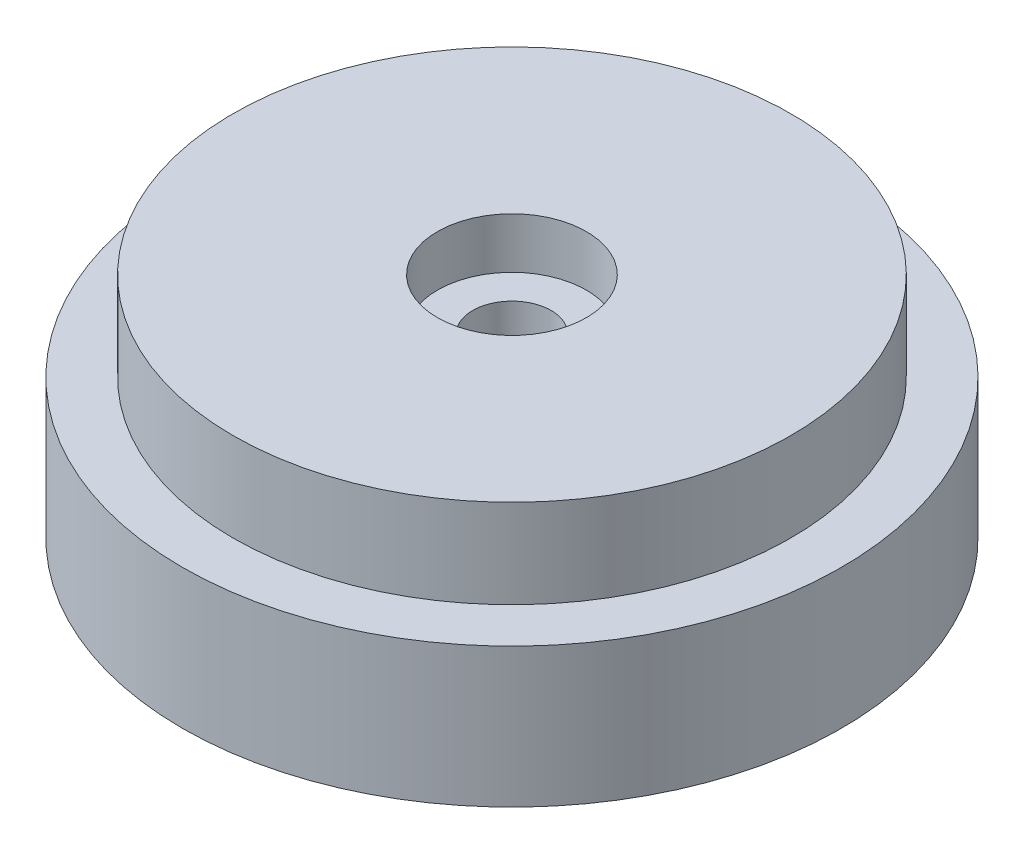
ISO-10303-21;
HEADER;
FILE_DESCRIPTION(('STEP AP214'),'2;1');
FILE_NAME('part.step','',(''),(''),'','','');
FILE_SCHEMA(('AUTOMOTIVE_DESIGN { 1 0 10303 214 1 1 1 1 }'));
ENDSEC;
DATA;
#1=APPLICATION_CONTEXT('core data for automotive mechanical design processes');
#2=APPLICATION_PROTOCOL_DEFINITION('international standard','automotive_design',2000,#1);
#3=PRODUCT_CONTEXT('',#1,'mechanical');
#4=PRODUCT('Part','Part','',(#3));
#5=PRODUCT_RELATED_PRODUCT_CATEGORY('part','',(#4));
#6=PRODUCT_DEFINITION_FORMATION('','',#4);
#7=PRODUCT_DEFINITION_CONTEXT('part definition',#1,'design');
#8=PRODUCT_DEFINITION('design','',#6,#7);
#9=PRODUCT_DEFINITION_SHAPE('','',#8);
#10=(LENGTH_UNIT() NAMED_UNIT(*) SI_UNIT(.MILLI.,.METRE.));
#11=(NAMED_UNIT(*) PLANE_ANGLE_UNIT() SI_UNIT($,.RADIAN.));
#12=(NAMED_UNIT(*) SI_UNIT($,.STERADIAN.) SOLID_ANGLE_UNIT());
#13=UNCERTAINTY_MEASURE_WITH_UNIT(LENGTH_MEASURE(1.E-05),#10,'distance_accuracy_value','');
#14=(GEOMETRIC_REPRESENTATION_CONTEXT(3) GLOBAL_UNCERTAINTY_ASSIGNED_CONTEXT((#13)) GLOBAL_UNIT_ASSIGNED_CONTEXT((#10,
#11,#12)) REPRESENTATION_CONTEXT('',''));
#15=CARTESIAN_POINT('',(0.,0.,0.));
#16=DIRECTION('',(0.,0.,1.));
#17=DIRECTION('',(1.,0.,0.));
#18=AXIS2_PLACEMENT_3D('',#15,#16,#17);
#19=CARTESIAN_POINT('',(0.,9.,0.));
#20=DIRECTION('',(0.,-1.,0.));
#21=DIRECTION('',(0.,0.,-1.));
#22=AXIS2_PLACEMENT_3D('',#19,#20,#21);
#23=CYLINDRICAL_SURFACE('',#22,2.94);
#24=CARTESIAN_POINT('',(0.,7.,0.));
#25=DIRECTION('',(0.,1.,0.));
#26=DIRECTION('',(0.,0.,1.));
#27=AXIS2_PLACEMENT_3D('',#24,#25,#26);
#28=CIRCLE('',#27,2.94);
#29=CARTESIAN_POINT('',(0.,7.,2.94));
#30=VERTEX_POINT('',#29);
#31=EDGE_CURVE('E10',#30,#30,#28,.T.);
#32=ORIENTED_EDGE('',*,*,#31,.F.);
#33=EDGE_LOOP('',(#32));
#34=FACE_BOUND('',#33,.T.);
#35=CARTESIAN_POINT('',(0.,9.,0.));
#36=DIRECTION('',(0.,1.,0.));
#37=DIRECTION('',(0.,0.,1.));
#38=AXIS2_PLACEMENT_3D('',#35,#36,#37);
#39=CIRCLE('',#38,2.94);
#40=CARTESIAN_POINT('',(0.,9.,2.94));
#41=VERTEX_POINT('',#40);
#42=EDGE_CURVE('E51',#41,#41,#39,.T.);
#43=ORIENTED_EDGE('',*,*,#42,.T.);
#44=EDGE_LOOP('',(#43));
#45=FACE_BOUND('',#44,.T.);
#46=ADVANCED_FACE('F41',(#34,#45),#23,.F.);
#47=CARTESIAN_POINT('',(0.,9.,0.));
#48=DIRECTION('',(0.,-1.,0.));
#49=DIRECTION('',(0.,0.,-1.));
#50=AXIS2_PLACEMENT_3D('',#47,#48,#49);
#51=CYLINDRICAL_SURFACE('',#50,11.);
#52=CARTESIAN_POINT('',(0.,5.5,0.));
#53=DIRECTION('',(0.,1.,0.));
#54=DIRECTION('',(0.,0.,1.));
#55=AXIS2_PLACEMENT_3D('',#52,#53,#54);
#56=CIRCLE('',#55,11.);
#57=CARTESIAN_POINT('',(0.,5.5,11.));
#58=VERTEX_POINT('',#57);
#59=EDGE_CURVE('E97',#58,#58,#56,.T.);
#60=ORIENTED_EDGE('',*,*,#59,.T.);
#61=EDGE_LOOP('',(#60));
#62=FACE_BOUND('',#61,.T.);
#63=CARTESIAN_POINT('',(0.,9.,0.));
#64=DIRECTION('',(0.,1.,0.));
#65=DIRECTION('',(0.,0.,1.));
#66=AXIS2_PLACEMENT_3D('',#63,#64,#65);
#67=CIRCLE('',#66,11.);
#68=CARTESIAN_POINT('',(0.,9.,11.));
#69=VERTEX_POINT('',#68);
#70=EDGE_CURVE('E47',#69,#69,#67,.T.);
#71=ORIENTED_EDGE('',*,*,#70,.F.);
#72=EDGE_LOOP('',(#71));
#73=FACE_BOUND('',#72,.T.);
#74=ADVANCED_FACE('F103',(#62,#73),#51,.T.);
#75=CARTESIAN_POINT('',(0.,9.,0.));
#76=DIRECTION('',(0.,1.,0.));
#77=DIRECTION('',(0.,0.,1.));
#78=AXIS2_PLACEMENT_3D('',#75,#76,#77);
#79=PLANE('',#78);
#80=ORIENTED_EDGE('',*,*,#42,.F.);
#81=EDGE_LOOP('',(#80));
#82=FACE_BOUND('',#81,.T.);
#83=ORIENTED_EDGE('',*,*,#70,.T.);
#84=EDGE_LOOP('',(#83));
#85=FACE_BOUND('',#84,.T.);
#86=ADVANCED_FACE('F122',(#82,#85),#79,.T.);
#87=CARTESIAN_POINT('',(0.,0.,0.));
#88=DIRECTION('',(0.,1.,0.));
#89=DIRECTION('',(0.,0.,1.));
#90=AXIS2_PLACEMENT_3D('',#87,#88,#89);
#91=PLANE('',#90);
#92=CARTESIAN_POINT('',(-5.,0.,-5.));
#93=DIRECTION('',(0.,1.,0.));
#94=DIRECTION('',(0.,0.,1.));
#95=AXIS2_PLACEMENT_3D('',#92,#93,#94);
#96=CIRCLE('',#95,3.05);
#97=CARTESIAN_POINT('',(-5.,0.,-8.05));
#98=VERTEX_POINT('',#97);
#99=EDGE_CURVE('E76',#98,#98,#96,.T.);
#100=ORIENTED_EDGE('',*,*,#99,.T.);
#101=EDGE_LOOP('',(#100));
#102=FACE_BOUND('',#101,.T.);
#103=CARTESIAN_POINT('',(-5.,0.,5.));
#104=DIRECTION('',(0.,1.,0.));
#105=DIRECTION('',(0.,0.,1.));
#106=AXIS2_PLACEMENT_3D('',#103,#104,#105);
#107=CIRCLE('',#106,3.05);
#108=CARTESIAN_POINT('',(-5.,0.,1.95));
#109=VERTEX_POINT('',#108);
#110=EDGE_CURVE('E83',#109,#109,#107,.T.);
#111=ORIENTED_EDGE('',*,*,#110,.T.);
#112=EDGE_LOOP('',(#111));
#113=FACE_BOUND('',#112,.T.);
#114=CARTESIAN_POINT('',(5.,0.,5.));
#115=DIRECTION('',(0.,1.,0.));
#116=DIRECTION('',(0.,0.,1.));
#117=AXIS2_PLACEMENT_3D('',#114,#115,#116);
#118=CIRCLE('',#117,3.05);
#119=CARTESIAN_POINT('',(5.,0.,1.95));
#120=VERTEX_POINT('',#119);
#121=EDGE_CURVE('E89',#120,#120,#118,.T.);
#122=ORIENTED_EDGE('',*,*,#121,.T.);
#123=EDGE_LOOP('',(#122));
#124=FACE_BOUND('',#123,.T.);
#125=CARTESIAN_POINT('',(5.,0.,-5.));
#126=DIRECTION('',(0.,1.,0.));
#127=DIRECTION('',(0.,0.,1.));
#128=AXIS2_PLACEMENT_3D('',#125,#126,#127);
#129=CIRCLE('',#128,3.05);
#130=CARTESIAN_POINT('',(5.,0.,-8.05));
#131=VERTEX_POINT('',#130);
#132=EDGE_CURVE('E70',#131,#131,#129,.T.);
#133=ORIENTED_EDGE('',*,*,#132,.T.);
#134=EDGE_LOOP('',(#133));
#135=FACE_BOUND('',#134,.T.);
#136=CARTESIAN_POINT('',(0.,0.,0.));
#137=DIRECTION('',(0.,1.,0.));
#138=DIRECTION('',(0.,0.,1.));
#139=AXIS2_PLACEMENT_3D('',#136,#137,#138);
#140=CIRCLE('',#139,2.94);
#141=CARTESIAN_POINT('',(0.,0.,2.94));
#142=VERTEX_POINT('',#141);
#143=EDGE_CURVE('E61',#142,#142,#140,.T.);
#144=ORIENTED_EDGE('',*,*,#143,.T.);
#145=EDGE_LOOP('',(#144));
#146=FACE_BOUND('',#145,.T.);
#147=CARTESIAN_POINT('',(0.,0.,0.));
#148=DIRECTION('',(0.,1.,0.));
#149=DIRECTION('',(0.,0.,1.));
#150=AXIS2_PLACEMENT_3D('',#147,#148,#149);
#151=CIRCLE('',#150,13.);
#152=CARTESIAN_POINT('',(0.,0.,13.));
#153=VERTEX_POINT('',#152);
#154=EDGE_CURVE('E94',#153,#153,#151,.T.);
#155=ORIENTED_EDGE('',*,*,#154,.F.);
#156=EDGE_LOOP('',(#155));
#157=FACE_BOUND('',#156,.T.);
#158=ADVANCED_FACE('F119',(#102,#113,#124,#135,#146,#157),#91,.F.);
#159=CARTESIAN_POINT('',(0.,7.,0.));
#160=DIRECTION('',(0.,-1.,0.));
#161=DIRECTION('',(0.,0.,-1.));
#162=AXIS2_PLACEMENT_3D('',#159,#160,#161);
#163=CYLINDRICAL_SURFACE('',#162,1.55);
#164=CARTESIAN_POINT('',(0.,3.,0.));
#165=DIRECTION('',(0.,1.,0.));
#166=DIRECTION('',(0.,0.,1.));
#167=AXIS2_PLACEMENT_3D('',#164,#165,#166);
#168=CIRCLE('',#167,1.55);
#169=CARTESIAN_POINT('',(0.,3.,1.55));
#170=VERTEX_POINT('',#169);
#171=EDGE_CURVE('E64',#170,#170,#168,.T.);
#172=ORIENTED_EDGE('',*,*,#171,.F.);
#173=EDGE_LOOP('',(#172));
#174=FACE_BOUND('',#173,.T.);
#175=CARTESIAN_POINT('',(0.,7.,0.));
#176=DIRECTION('',(0.,1.,0.));
#177=DIRECTION('',(0.,0.,1.));
#178=AXIS2_PLACEMENT_3D('',#175,#176,#177);
#179=CIRCLE('',#178,1.55);
#180=CARTESIAN_POINT('',(0.,7.,1.55));
#181=VERTEX_POINT('',#180);
#182=EDGE_CURVE('E55',#181,#181,#179,.T.);
#183=ORIENTED_EDGE('',*,*,#182,.T.);
#184=EDGE_LOOP('',(#183));
#185=FACE_BOUND('',#184,.T.);
#186=ADVANCED_FACE('F121',(#174,#185),#163,.F.);
#187=CARTESIAN_POINT('',(0.,7.,0.));
#188=DIRECTION('',(0.,1.,0.));
#189=DIRECTION('',(0.,0.,1.));
#190=AXIS2_PLACEMENT_3D('',#187,#188,#189);
#191=PLANE('',#190);
#192=ORIENTED_EDGE('',*,*,#182,.F.);
#193=EDGE_LOOP('',(#192));
#194=FACE_BOUND('',#193,.T.);
#195=ORIENTED_EDGE('',*,*,#31,.T.);
#196=EDGE_LOOP('',(#195));
#197=FACE_BOUND('',#196,.T.);
#198=ADVANCED_FACE('F129',(#194,#197),#191,.T.);
#199=CARTESIAN_POINT('',(0.,3.,0.));
#200=DIRECTION('',(0.,-1.,0.));
#201=DIRECTION('',(0.,0.,-1.));
#202=AXIS2_PLACEMENT_3D('',#199,#200,#201);
#203=CYLINDRICAL_SURFACE('',#202,2.94);
#204=CARTESIAN_POINT('',(0.,3.,0.));
#205=DIRECTION('',(0.,1.,0.));
#206=DIRECTION('',(0.,0.,1.));
#207=AXIS2_PLACEMENT_3D('',#204,#205,#206);
#208=CIRCLE('',#207,2.94);
#209=CARTESIAN_POINT('',(0.,3.,2.94));
#210=VERTEX_POINT('',#209);
#211=EDGE_CURVE('E60',#210,#210,#208,.T.);
#212=ORIENTED_EDGE('',*,*,#211,.T.);
#213=EDGE_LOOP('',(#212));
#214=FACE_BOUND('',#213,.T.);
#215=ORIENTED_EDGE('',*,*,#143,.F.);
#216=EDGE_LOOP('',(#215));
#217=FACE_BOUND('',#216,.T.);
#218=ADVANCED_FACE('F225',(#214,#217),#203,.F.);
#219=CARTESIAN_POINT('',(0.,3.,0.));
#220=DIRECTION('',(0.,1.,0.));
#221=DIRECTION('',(0.,0.,1.));
#222=AXIS2_PLACEMENT_3D('',#219,#220,#221);
#223=PLANE('',#222);
#224=ORIENTED_EDGE('',*,*,#171,.T.);
#225=EDGE_LOOP('',(#224));
#226=FACE_BOUND('',#225,.T.);
#227=ORIENTED_EDGE('',*,*,#211,.F.);
#228=EDGE_LOOP('',(#227));
#229=FACE_BOUND('',#228,.T.);
#230=ADVANCED_FACE('F216',(#226,#229),#223,.F.);
#231=CARTESIAN_POINT('',(5.,8.6,-5.));
#232=DIRECTION('',(0.,-1.,0.));
#233=DIRECTION('',(0.,0.,-1.));
#234=AXIS2_PLACEMENT_3D('',#231,#232,#233);
#235=CYLINDRICAL_SURFACE('',#234,3.05);
#236=CARTESIAN_POINT('',(5.,8.6,-5.));
#237=DIRECTION('',(0.,1.,0.));
#238=DIRECTION('',(0.,0.,1.));
#239=AXIS2_PLACEMENT_3D('',#236,#237,#238);
#240=CIRCLE('',#239,3.05);
#241=CARTESIAN_POINT('',(5.,8.6,-8.05));
#242=VERTEX_POINT('',#241);
#243=EDGE_CURVE('E65',#242,#242,#240,.T.);
#244=CARTESIAN_POINT('',(5.,8.6,-8.05));
#245=CARTESIAN_POINT('',(5.,8.51041666666666,-8.05));
#246=CARTESIAN_POINT('',(5.,8.42083333333333,-8.05));
#247=CARTESIAN_POINT('',(5.,8.24166666666667,-8.05));
#248=CARTESIAN_POINT('',(5.,8.15208333333333,-8.05));
#249=CARTESIAN_POINT('',(5.,7.97291666666667,-8.05));
#250=CARTESIAN_POINT('',(5.,7.88333333333333,-8.05));
#251=CARTESIAN_POINT('',(5.,7.70416666666667,-8.05));
#252=CARTESIAN_POINT('',(5.,7.61458333333333,-8.05));
#253=CARTESIAN_POINT('',(5.,7.43541666666667,-8.05));
#254=CARTESIAN_POINT('',(5.,7.34583333333333,-8.05));
#255=CARTESIAN_POINT('',(5.,7.16666666666667,-8.05));
#256=CARTESIAN_POINT('',(5.,7.07708333333333,-8.05));
#257=CARTESIAN_POINT('',(5.,6.89791666666667,-8.05));
#258=CARTESIAN_POINT('',(5.,6.80833333333333,-8.05));
#259=CARTESIAN_POINT('',(5.,6.62916666666667,-8.05));
#260=CARTESIAN_POINT('',(5.,6.53958333333333,-8.05));
#261=CARTESIAN_POINT('',(5.,6.36041666666667,-8.05));
#262=CARTESIAN_POINT('',(5.,6.27083333333333,-8.05));
#263=CARTESIAN_POINT('',(5.,6.09166666666667,-8.05));
#264=CARTESIAN_POINT('',(5.,6.00208333333333,-8.05));
#265=CARTESIAN_POINT('',(5.,5.82291666666667,-8.05));
#266=CARTESIAN_POINT('',(5.,5.73333333333333,-8.05));
#267=CARTESIAN_POINT('',(5.,5.55416666666667,-8.05));
#268=CARTESIAN_POINT('',(5.,5.46458333333333,-8.05));
#269=CARTESIAN_POINT('',(5.,5.28541666666667,-8.05));
#270=CARTESIAN_POINT('',(5.,5.19583333333333,-8.05));
#271=CARTESIAN_POINT('',(5.,5.01666666666667,-8.05));
#272=CARTESIAN_POINT('',(5.,4.92708333333333,-8.05));
#273=CARTESIAN_POINT('',(5.,4.74791666666667,-8.05));
#274=CARTESIAN_POINT('',(5.,4.65833333333333,-8.05));
#275=CARTESIAN_POINT('',(5.,4.47916666666667,-8.05));
#276=CARTESIAN_POINT('',(5.,4.38958333333333,-8.05));
#277=CARTESIAN_POINT('',(5.,4.21041666666667,-8.05));
#278=CARTESIAN_POINT('',(5.,4.12083333333333,-8.05));
#279=CARTESIAN_POINT('',(5.,3.94166666666667,-8.05));
#280=CARTESIAN_POINT('',(5.,3.85208333333333,-8.05));
#281=CARTESIAN_POINT('',(5.,3.67291666666667,-8.05));
#282=CARTESIAN_POINT('',(5.,3.58333333333333,-8.05));
#283=CARTESIAN_POINT('',(5.,3.40416666666667,-8.05));
#284=CARTESIAN_POINT('',(5.,3.31458333333333,-8.05));
#285=CARTESIAN_POINT('',(5.,3.13541666666667,-8.05));
#286=CARTESIAN_POINT('',(5.,3.04583333333333,-8.05));
#287=CARTESIAN_POINT('',(5.,2.86666666666667,-8.05));
#288=CARTESIAN_POINT('',(5.,2.77708333333333,-8.05));
#289=CARTESIAN_POINT('',(5.,2.59791666666667,-8.05));
#290=CARTESIAN_POINT('',(5.,2.50833333333333,-8.05));
#291=CARTESIAN_POINT('',(5.,2.32916666666667,-8.05));
#292=CARTESIAN_POINT('',(5.,2.23958333333333,-8.05));
#293=CARTESIAN_POINT('',(5.,2.06041666666667,-8.05));
#294=CARTESIAN_POINT('',(5.,1.97083333333333,-8.05));
#295=CARTESIAN_POINT('',(5.,1.79166666666667,-8.05));
#296=CARTESIAN_POINT('',(5.,1.70208333333333,-8.05));
#297=CARTESIAN_POINT('',(5.,1.52291666666667,-8.05));
#298=CARTESIAN_POINT('',(5.,1.43333333333333,-8.05));
#299=CARTESIAN_POINT('',(5.,1.25416666666667,-8.05));
#300=CARTESIAN_POINT('',(5.,1.16458333333333,-8.05));
#301=CARTESIAN_POINT('',(5.,0.985416666666665,-8.05));
#302=CARTESIAN_POINT('',(5.,0.895833333333332,-8.05));
#303=CARTESIAN_POINT('',(5.,0.716666666666665,-8.05));
#304=CARTESIAN_POINT('',(5.,0.627083333333332,-8.05));
#305=CARTESIAN_POINT('',(5.,0.447916666666665,-8.05));
#306=CARTESIAN_POINT('',(5.,0.358333333333331,-8.05));
#307=CARTESIAN_POINT('',(5.,0.179166666666665,-8.05));
#308=CARTESIAN_POINT('',(5.,0.0895833333333315,-8.05));
#309=CARTESIAN_POINT('',(5.,0.,-8.05));
#310=B_SPLINE_CURVE_WITH_KNOTS('',3,(#244,#245,#246,#247,#248,#249,#250,#251,#252,#253,#254,
#255,#256,#257,#258,#259,#260,#261,#262,#263,#264,#265,#266,#267,#268,#269,#270,#271,#272,#273,
#274,#275,#276,#277,#278,#279,#280,#281,#282,#283,#284,#285,#286,#287,#288,#289,#290,#291,#292,
#293,#294,#295,#296,#297,#298,#299,#300,#301,#302,#303,#304,#305,#306,#307,#308,#309),
.UNSPECIFIED.,.F.,.F.,(4,2,2,2,2,2,2,2,2,2,2,2,2,2,2,2,2,2,2,2,2,2,2,2,2,2,2,2,2,2,2,2,4),(0.,
0.26875,0.5375,0.806249999999999,1.075,1.34375,1.6125,1.88125,2.15,2.41875,2.6875,2.95625,3.225,
3.49375,3.7625,4.03125,4.3,4.56875,4.8375,5.10625,5.375,5.64375,5.9125,6.18125,6.45,6.71875,
6.9875,7.25625,7.525,7.79375,8.0625,8.33125,8.6),.UNSPECIFIED.);
#311=EDGE_CURVE('BSEAM207',#242,#131,#310,.T.);
#312=ORIENTED_EDGE('',*,*,#243,.T.);
#313=ORIENTED_EDGE('',*,*,#132,.F.);
#314=ORIENTED_EDGE('',*,*,#311,.T.);
#315=ORIENTED_EDGE('',*,*,#311,.F.);
#316=EDGE_LOOP('',(#312,#314,#313,#315));
#317=FACE_BOUND('',#316,.T.);
#318=ADVANCED_FACE('F207',(#317),#235,.F.);
#319=CARTESIAN_POINT('',(0.,8.6,0.));
#320=DIRECTION('',(0.,1.,0.));
#321=DIRECTION('',(0.,0.,1.));
#322=AXIS2_PLACEMENT_3D('',#319,#320,#321);
#323=PLANE('',#322);
#324=ORIENTED_EDGE('',*,*,#243,.F.);
#325=EDGE_LOOP('',(#324));
#326=FACE_BOUND('',#325,.T.);
#327=ADVANCED_FACE('F198',(#326),#323,.F.);
#328=CARTESIAN_POINT('',(5.,8.6,5.));
#329=DIRECTION('',(0.,-1.,0.));
#330=DIRECTION('',(0.,0.,-1.));
#331=AXIS2_PLACEMENT_3D('',#328,#329,#330);
#332=CYLINDRICAL_SURFACE('',#331,3.05);
#333=CARTESIAN_POINT('',(5.,8.6,5.));
#334=DIRECTION('',(0.,1.,0.));
#335=DIRECTION('',(0.,0.,1.));
#336=AXIS2_PLACEMENT_3D('',#333,#334,#335);
#337=CIRCLE('',#336,3.05);
#338=CARTESIAN_POINT('',(5.,8.6,1.95));
#339=VERTEX_POINT('',#338);
#340=EDGE_CURVE('E73',#339,#339,#337,.T.);
#341=CARTESIAN_POINT('',(5.,8.6,1.95));
#342=CARTESIAN_POINT('',(5.,8.51041666666666,1.95));
#343=CARTESIAN_POINT('',(5.,8.42083333333333,1.95));
#344=CARTESIAN_POINT('',(5.,8.24166666666667,1.95));
#345=CARTESIAN_POINT('',(5.,8.15208333333333,1.95));
#346=CARTESIAN_POINT('',(5.,7.97291666666667,1.95));
#347=CARTESIAN_POINT('',(5.,7.88333333333333,1.95));
#348=CARTESIAN_POINT('',(5.,7.70416666666667,1.95));
#349=CARTESIAN_POINT('',(5.,7.61458333333333,1.95));
#350=CARTESIAN_POINT('',(5.,7.43541666666667,1.95));
#351=CARTESIAN_POINT('',(5.,7.34583333333333,1.95));
#352=CARTESIAN_POINT('',(5.,7.16666666666667,1.95));
#353=CARTESIAN_POINT('',(5.,7.07708333333333,1.95));
#354=CARTESIAN_POINT('',(5.,6.89791666666667,1.95));
#355=CARTESIAN_POINT('',(5.,6.80833333333333,1.95));
#356=CARTESIAN_POINT('',(5.,6.62916666666667,1.95));
#357=CARTESIAN_POINT('',(5.,6.53958333333333,1.95));
#358=CARTESIAN_POINT('',(5.,6.36041666666667,1.95));
#359=CARTESIAN_POINT('',(5.,6.27083333333333,1.95));
#360=CARTESIAN_POINT('',(5.,6.09166666666667,1.95));
#361=CARTESIAN_POINT('',(5.,6.00208333333333,1.95));
#362=CARTESIAN_POINT('',(5.,5.82291666666667,1.95));
#363=CARTESIAN_POINT('',(5.,5.73333333333333,1.95));
#364=CARTESIAN_POINT('',(5.,5.55416666666667,1.95));
#365=CARTESIAN_POINT('',(5.,5.46458333333333,1.95));
#366=CARTESIAN_POINT('',(5.,5.28541666666667,1.95));
#367=CARTESIAN_POINT('',(5.,5.19583333333333,1.95));
#368=CARTESIAN_POINT('',(5.,5.01666666666667,1.95));
#369=CARTESIAN_POINT('',(5.,4.92708333333333,1.95));
#370=CARTESIAN_POINT('',(5.,4.74791666666667,1.95));
#371=CARTESIAN_POINT('',(5.,4.65833333333333,1.95));
#372=CARTESIAN_POINT('',(5.,4.47916666666667,1.95));
#373=CARTESIAN_POINT('',(5.,4.38958333333333,1.95));
#374=CARTESIAN_POINT('',(5.,4.21041666666667,1.95));
#375=CARTESIAN_POINT('',(5.,4.12083333333333,1.95));
#376=CARTESIAN_POINT('',(5.,3.94166666666667,1.95));
#377=CARTESIAN_POINT('',(5.,3.85208333333333,1.95));
#378=CARTESIAN_POINT('',(5.,3.67291666666667,1.95));
#379=CARTESIAN_POINT('',(5.,3.58333333333333,1.95));
#380=CARTESIAN_POINT('',(5.,3.40416666666667,1.95));
#381=CARTESIAN_POINT('',(5.,3.31458333333333,1.95));
#382=CARTESIAN_POINT('',(5.,3.13541666666667,1.95));
#383=CARTESIAN_POINT('',(5.,3.04583333333333,1.95));
#384=CARTESIAN_POINT('',(5.,2.86666666666667,1.95));
#385=CARTESIAN_POINT('',(5.,2.77708333333333,1.95));
#386=CARTESIAN_POINT('',(5.,2.59791666666667,1.95));
#387=CARTESIAN_POINT('',(5.,2.50833333333333,1.95));
#388=CARTESIAN_POINT('',(5.,2.32916666666667,1.95));
#389=CARTESIAN_POINT('',(5.,2.23958333333333,1.95));
#390=CARTESIAN_POINT('',(5.,2.06041666666667,1.95));
#391=CARTESIAN_POINT('',(5.,1.97083333333333,1.95));
#392=CARTESIAN_POINT('',(5.,1.79166666666667,1.95));
#393=CARTESIAN_POINT('',(5.,1.70208333333333,1.95));
#394=CARTESIAN_POINT('',(5.,1.52291666666667,1.95));
#395=CARTESIAN_POINT('',(5.,1.43333333333333,1.95));
#396=CARTESIAN_POINT('',(5.,1.25416666666667,1.95));
#397=CARTESIAN_POINT('',(5.,1.16458333333333,1.95));
#398=CARTESIAN_POINT('',(5.,0.985416666666665,1.95));
#399=CARTESIAN_POINT('',(5.,0.895833333333332,1.95));
#400=CARTESIAN_POINT('',(5.,0.716666666666665,1.95));
#401=CARTESIAN_POINT('',(5.,0.627083333333332,1.95));
#402=CARTESIAN_POINT('',(5.,0.447916666666665,1.95));
#403=CARTESIAN_POINT('',(5.,0.358333333333331,1.95));
#404=CARTESIAN_POINT('',(5.,0.179166666666665,1.95));
#405=CARTESIAN_POINT('',(5.,0.0895833333333315,1.95));
#406=CARTESIAN_POINT('',(5.,0.,1.95));
#407=B_SPLINE_CURVE_WITH_KNOTS('',3,(#341,#342,#343,#344,#345,#346,#347,#348,#349,#350,#351,
#352,#353,#354,#355,#356,#357,#358,#359,#360,#361,#362,#363,#364,#365,#366,#367,#368,#369,#370,
#371,#372,#373,#374,#375,#376,#377,#378,#379,#380,#381,#382,#383,#384,#385,#386,#387,#388,#389,
#390,#391,#392,#393,#394,#395,#396,#397,#398,#399,#400,#401,#402,#403,#404,#405,#406),
.UNSPECIFIED.,.F.,.F.,(4,2,2,2,2,2,2,2,2,2,2,2,2,2,2,2,2,2,2,2,2,2,2,2,2,2,2,2,2,2,2,2,4),(0.,
0.26875,0.5375,0.806249999999999,1.075,1.34375,1.6125,1.88125,2.15,2.41875,2.6875,2.95625,3.225,
3.49375,3.7625,4.03125,4.3,4.56875,4.8375,5.10625,5.375,5.64375,5.9125,6.18125,6.45,6.71875,
6.9875,7.25625,7.525,7.79375,8.0625,8.33125,8.6),.UNSPECIFIED.);
#408=EDGE_CURVE('BSEAM189',#339,#120,#407,.T.);
#409=ORIENTED_EDGE('',*,*,#340,.T.);
#410=ORIENTED_EDGE('',*,*,#121,.F.);
#411=ORIENTED_EDGE('',*,*,#408,.T.);
#412=ORIENTED_EDGE('',*,*,#408,.F.);
#413=EDGE_LOOP('',(#409,#411,#410,#412));
#414=FACE_BOUND('',#413,.T.);
#415=ADVANCED_FACE('F189',(#414),#332,.F.);
#416=CARTESIAN_POINT('',(0.,8.6,0.));
#417=DIRECTION('',(0.,1.,0.));
#418=DIRECTION('',(0.,0.,1.));
#419=AXIS2_PLACEMENT_3D('',#416,#417,#418);
#420=PLANE('',#419);
#421=ORIENTED_EDGE('',*,*,#340,.F.);
#422=EDGE_LOOP('',(#421));
#423=FACE_BOUND('',#422,.T.);
#424=ADVANCED_FACE('F180',(#423),#420,.F.);
#425=CARTESIAN_POINT('',(-5.,8.6,5.));
#426=DIRECTION('',(0.,-1.,0.));
#427=DIRECTION('',(0.,0.,-1.));
#428=AXIS2_PLACEMENT_3D('',#425,#426,#427);
#429=CYLINDRICAL_SURFACE('',#428,3.05);
#430=CARTESIAN_POINT('',(-5.,8.6,5.));
#431=DIRECTION('',(0.,1.,0.));
#432=DIRECTION('',(0.,0.,1.));
#433=AXIS2_PLACEMENT_3D('',#430,#431,#432);
#434=CIRCLE('',#433,3.05);
#435=CARTESIAN_POINT('',(-5.,8.6,1.95));
#436=VERTEX_POINT('',#435);
#437=EDGE_CURVE('E86',#436,#436,#434,.T.);
#438=CARTESIAN_POINT('',(-5.,8.6,1.95));
#439=CARTESIAN_POINT('',(-5.,8.51041666666666,1.95));
#440=CARTESIAN_POINT('',(-5.,8.42083333333333,1.95));
#441=CARTESIAN_POINT('',(-5.,8.24166666666667,1.95));
#442=CARTESIAN_POINT('',(-5.,8.15208333333333,1.95));
#443=CARTESIAN_POINT('',(-5.,7.97291666666667,1.95));
#444=CARTESIAN_POINT('',(-5.,7.88333333333333,1.95));
#445=CARTESIAN_POINT('',(-5.,7.70416666666667,1.95));
#446=CARTESIAN_POINT('',(-5.,7.61458333333333,1.95));
#447=CARTESIAN_POINT('',(-5.,7.43541666666667,1.95));
#448=CARTESIAN_POINT('',(-5.,7.34583333333333,1.95));
#449=CARTESIAN_POINT('',(-5.,7.16666666666667,1.95));
#450=CARTESIAN_POINT('',(-5.,7.07708333333333,1.95));
#451=CARTESIAN_POINT('',(-5.,6.89791666666667,1.95));
#452=CARTESIAN_POINT('',(-5.,6.80833333333333,1.95));
#453=CARTESIAN_POINT('',(-5.,6.62916666666667,1.95));
#454=CARTESIAN_POINT('',(-5.,6.53958333333333,1.95));
#455=CARTESIAN_POINT('',(-5.,6.36041666666667,1.95));
#456=CARTESIAN_POINT('',(-5.,6.27083333333333,1.95));
#457=CARTESIAN_POINT('',(-5.,6.09166666666667,1.95));
#458=CARTESIAN_POINT('',(-5.,6.00208333333333,1.95));
#459=CARTESIAN_POINT('',(-5.,5.82291666666667,1.95));
#460=CARTESIAN_POINT('',(-5.,5.73333333333333,1.95));
#461=CARTESIAN_POINT('',(-5.,5.55416666666667,1.95));
#462=CARTESIAN_POINT('',(-5.,5.46458333333333,1.95));
#463=CARTESIAN_POINT('',(-5.,5.28541666666667,1.95));
#464=CARTESIAN_POINT('',(-5.,5.19583333333333,1.95));
#465=CARTESIAN_POINT('',(-5.,5.01666666666667,1.95));
#466=CARTESIAN_POINT('',(-5.,4.92708333333333,1.95));
#467=CARTESIAN_POINT('',(-5.,4.74791666666667,1.95));
#468=CARTESIAN_POINT('',(-5.,4.65833333333333,1.95));
#469=CARTESIAN_POINT('',(-5.,4.47916666666667,1.95));
#470=CARTESIAN_POINT('',(-5.,4.38958333333333,1.95));
#471=CARTESIAN_POINT('',(-5.,4.21041666666667,1.95));
#472=CARTESIAN_POINT('',(-5.,4.12083333333333,1.95));
#473=CARTESIAN_POINT('',(-5.,3.94166666666667,1.95));
#474=CARTESIAN_POINT('',(-5.,3.85208333333333,1.95));
#475=CARTESIAN_POINT('',(-5.,3.67291666666667,1.95));
#476=CARTESIAN_POINT('',(-5.,3.58333333333333,1.95));
#477=CARTESIAN_POINT('',(-5.,3.40416666666667,1.95));
#478=CARTESIAN_POINT('',(-5.,3.31458333333333,1.95));
#479=CARTESIAN_POINT('',(-5.,3.13541666666667,1.95));
#480=CARTESIAN_POINT('',(-5.,3.04583333333333,1.95));
#481=CARTESIAN_POINT('',(-5.,2.86666666666667,1.95));
#482=CARTESIAN_POINT('',(-5.,2.77708333333333,1.95));
#483=CARTESIAN_POINT('',(-5.,2.59791666666667,1.95));
#484=CARTESIAN_POINT('',(-5.,2.50833333333333,1.95));
#485=CARTESIAN_POINT('',(-5.,2.32916666666667,1.95));
#486=CARTESIAN_POINT('',(-5.,2.23958333333333,1.95));
#487=CARTESIAN_POINT('',(-5.,2.06041666666667,1.95));
#488=CARTESIAN_POINT('',(-5.,1.97083333333333,1.95));
#489=CARTESIAN_POINT('',(-5.,1.79166666666667,1.95));
#490=CARTESIAN_POINT('',(-5.,1.70208333333333,1.95));
#491=CARTESIAN_POINT('',(-5.,1.52291666666667,1.95));
#492=CARTESIAN_POINT('',(-5.,1.43333333333333,1.95));
#493=CARTESIAN_POINT('',(-5.,1.25416666666667,1.95));
#494=CARTESIAN_POINT('',(-5.,1.16458333333333,1.95));
#495=CARTESIAN_POINT('',(-5.,0.985416666666665,1.95));
#496=CARTESIAN_POINT('',(-5.,0.895833333333332,1.95));
#497=CARTESIAN_POINT('',(-5.,0.716666666666665,1.95));
#498=CARTESIAN_POINT('',(-5.,0.627083333333332,1.95));
#499=CARTESIAN_POINT('',(-5.,0.447916666666665,1.95));
#500=CARTESIAN_POINT('',(-5.,0.358333333333331,1.95));
#501=CARTESIAN_POINT('',(-5.,0.179166666666665,1.95));
#502=CARTESIAN_POINT('',(-5.,0.0895833333333315,1.95));
#503=CARTESIAN_POINT('',(-5.,0.,1.95));
#504=B_SPLINE_CURVE_WITH_KNOTS('',3,(#438,#439,#440,#441,#442,#443,#444,#445,#446,#447,#448,
#449,#450,#451,#452,#453,#454,#455,#456,#457,#458,#459,#460,#461,#462,#463,#464,#465,#466,#467,
#468,#469,#470,#471,#472,#473,#474,#475,#476,#477,#478,#479,#480,#481,#482,#483,#484,#485,#486,
#487,#488,#489,#490,#491,#492,#493,#494,#495,#496,#497,#498,#499,#500,#501,#502,#503),
.UNSPECIFIED.,.F.,.F.,(4,2,2,2,2,2,2,2,2,2,2,2,2,2,2,2,2,2,2,2,2,2,2,2,2,2,2,2,2,2,2,2,4),(0.,
0.26875,0.5375,0.806249999999999,1.075,1.34375,1.6125,1.88125,2.15,2.41875,2.6875,2.95625,3.225,
3.49375,3.7625,4.03125,4.3,4.56875,4.8375,5.10625,5.375,5.64375,5.9125,6.18125,6.45,6.71875,
6.9875,7.25625,7.525,7.79375,8.0625,8.33125,8.6),.UNSPECIFIED.);
#505=EDGE_CURVE('BSEAM171',#436,#109,#504,.T.);
#506=ORIENTED_EDGE('',*,*,#437,.T.);
#507=ORIENTED_EDGE('',*,*,#110,.F.);
#508=ORIENTED_EDGE('',*,*,#505,.T.);
#509=ORIENTED_EDGE('',*,*,#505,.F.);
#510=EDGE_LOOP('',(#506,#508,#507,#509));
#511=FACE_BOUND('',#510,.T.);
#512=ADVANCED_FACE('F171',(#511),#429,.F.);
#513=CARTESIAN_POINT('',(0.,8.6,0.));
#514=DIRECTION('',(0.,1.,0.));
#515=DIRECTION('',(0.,0.,1.));
#516=AXIS2_PLACEMENT_3D('',#513,#514,#515);
#517=PLANE('',#516);
#518=ORIENTED_EDGE('',*,*,#437,.F.);
#519=EDGE_LOOP('',(#518));
#520=FACE_BOUND('',#519,.T.);
#521=ADVANCED_FACE('F162',(#520),#517,.F.);
#522=CARTESIAN_POINT('',(-5.,8.6,-5.));
#523=DIRECTION('',(0.,-1.,0.));
#524=DIRECTION('',(0.,0.,-1.));
#525=AXIS2_PLACEMENT_3D('',#522,#523,#524);
#526=CYLINDRICAL_SURFACE('',#525,3.05);
#527=CARTESIAN_POINT('',(-5.,8.6,-5.));
#528=DIRECTION('',(0.,1.,0.));
#529=DIRECTION('',(0.,0.,1.));
#530=AXIS2_PLACEMENT_3D('',#527,#528,#529);
#531=CIRCLE('',#530,3.05);
#532=CARTESIAN_POINT('',(-5.,8.6,-8.05));
#533=VERTEX_POINT('',#532);
#534=EDGE_CURVE('E79',#533,#533,#531,.T.);
#535=CARTESIAN_POINT('',(-5.,8.6,-8.05));
#536=CARTESIAN_POINT('',(-5.,8.51041666666666,-8.05));
#537=CARTESIAN_POINT('',(-5.,8.42083333333333,-8.05));
#538=CARTESIAN_POINT('',(-5.,8.24166666666667,-8.05));
#539=CARTESIAN_POINT('',(-5.,8.15208333333333,-8.05));
#540=CARTESIAN_POINT('',(-5.,7.97291666666667,-8.05));
#541=CARTESIAN_POINT('',(-5.,7.88333333333333,-8.05));
#542=CARTESIAN_POINT('',(-5.,7.70416666666667,-8.05));
#543=CARTESIAN_POINT('',(-5.,7.61458333333333,-8.05));
#544=CARTESIAN_POINT('',(-5.,7.43541666666667,-8.05));
#545=CARTESIAN_POINT('',(-5.,7.34583333333333,-8.05));
#546=CARTESIAN_POINT('',(-5.,7.16666666666667,-8.05));
#547=CARTESIAN_POINT('',(-5.,7.07708333333333,-8.05));
#548=CARTESIAN_POINT('',(-5.,6.89791666666667,-8.05));
#549=CARTESIAN_POINT('',(-5.,6.80833333333333,-8.05));
#550=CARTESIAN_POINT('',(-5.,6.62916666666667,-8.05));
#551=CARTESIAN_POINT('',(-5.,6.53958333333333,-8.05));
#552=CARTESIAN_POINT('',(-5.,6.36041666666667,-8.05));
#553=CARTESIAN_POINT('',(-5.,6.27083333333333,-8.05));
#554=CARTESIAN_POINT('',(-5.,6.09166666666667,-8.05));
#555=CARTESIAN_POINT('',(-5.,6.00208333333333,-8.05));
#556=CARTESIAN_POINT('',(-5.,5.82291666666667,-8.05));
#557=CARTESIAN_POINT('',(-5.,5.73333333333333,-8.05));
#558=CARTESIAN_POINT('',(-5.,5.55416666666667,-8.05));
#559=CARTESIAN_POINT('',(-5.,5.46458333333333,-8.05));
#560=CARTESIAN_POINT('',(-5.,5.28541666666667,-8.05));
#561=CARTESIAN_POINT('',(-5.,5.19583333333333,-8.05));
#562=CARTESIAN_POINT('',(-5.,5.01666666666667,-8.05));
#563=CARTESIAN_POINT('',(-5.,4.92708333333333,-8.05));
#564=CARTESIAN_POINT('',(-5.,4.74791666666667,-8.05));
#565=CARTESIAN_POINT('',(-5.,4.65833333333333,-8.05));
#566=CARTESIAN_POINT('',(-5.,4.47916666666667,-8.05));
#567=CARTESIAN_POINT('',(-5.,4.38958333333333,-8.05));
#568=CARTESIAN_POINT('',(-5.,4.21041666666667,-8.05));
#569=CARTESIAN_POINT('',(-5.,4.12083333333333,-8.05));
#570=CARTESIAN_POINT('',(-5.,3.94166666666667,-8.05));
#571=CARTESIAN_POINT('',(-5.,3.85208333333333,-8.05));
#572=CARTESIAN_POINT('',(-5.,3.67291666666667,-8.05));
#573=CARTESIAN_POINT('',(-5.,3.58333333333333,-8.05));
#574=CARTESIAN_POINT('',(-5.,3.40416666666667,-8.05));
#575=CARTESIAN_POINT('',(-5.,3.31458333333333,-8.05));
#576=CARTESIAN_POINT('',(-5.,3.13541666666667,-8.05));
#577=CARTESIAN_POINT('',(-5.,3.04583333333333,-8.05));
#578=CARTESIAN_POINT('',(-5.,2.86666666666667,-8.05));
#579=CARTESIAN_POINT('',(-5.,2.77708333333333,-8.05));
#580=CARTESIAN_POINT('',(-5.,2.59791666666667,-8.05));
#581=CARTESIAN_POINT('',(-5.,2.50833333333333,-8.05));
#582=CARTESIAN_POINT('',(-5.,2.32916666666667,-8.05));
#583=CARTESIAN_POINT('',(-5.,2.23958333333333,-8.05));
#584=CARTESIAN_POINT('',(-5.,2.06041666666667,-8.05));
#585=CARTESIAN_POINT('',(-5.,1.97083333333333,-8.05));
#586=CARTESIAN_POINT('',(-5.,1.79166666666667,-8.05));
#587=CARTESIAN_POINT('',(-5.,1.70208333333333,-8.05));
#588=CARTESIAN_POINT('',(-5.,1.52291666666667,-8.05));
#589=CARTESIAN_POINT('',(-5.,1.43333333333333,-8.05));
#590=CARTESIAN_POINT('',(-5.,1.25416666666667,-8.05));
#591=CARTESIAN_POINT('',(-5.,1.16458333333333,-8.05));
#592=CARTESIAN_POINT('',(-5.,0.985416666666665,-8.05));
#593=CARTESIAN_POINT('',(-5.,0.895833333333332,-8.05));
#594=CARTESIAN_POINT('',(-5.,0.716666666666665,-8.05));
#595=CARTESIAN_POINT('',(-5.,0.627083333333332,-8.05));
#596=CARTESIAN_POINT('',(-5.,0.447916666666665,-8.05));
#597=CARTESIAN_POINT('',(-5.,0.358333333333331,-8.05));
#598=CARTESIAN_POINT('',(-5.,0.179166666666665,-8.05));
#599=CARTESIAN_POINT('',(-5.,0.0895833333333315,-8.05));
#600=CARTESIAN_POINT('',(-5.,0.,-8.05));
#601=B_SPLINE_CURVE_WITH_KNOTS('',3,(#535,#536,#537,#538,#539,#540,#541,#542,#543,#544,#545,
#546,#547,#548,#549,#550,#551,#552,#553,#554,#555,#556,#557,#558,#559,#560,#561,#562,#563,#564,
#565,#566,#567,#568,#569,#570,#571,#572,#573,#574,#575,#576,#577,#578,#579,#580,#581,#582,#583,
#584,#585,#586,#587,#588,#589,#590,#591,#592,#593,#594,#595,#596,#597,#598,#599,#600),
.UNSPECIFIED.,.F.,.F.,(4,2,2,2,2,2,2,2,2,2,2,2,2,2,2,2,2,2,2,2,2,2,2,2,2,2,2,2,2,2,2,2,4),(0.,
0.26875,0.5375,0.806249999999999,1.075,1.34375,1.6125,1.88125,2.15,2.41875,2.6875,2.95625,3.225,
3.49375,3.7625,4.03125,4.3,4.56875,4.8375,5.10625,5.375,5.64375,5.9125,6.18125,6.45,6.71875,
6.9875,7.25625,7.525,7.79375,8.0625,8.33125,8.6),.UNSPECIFIED.);
#602=EDGE_CURVE('BSEAM153',#533,#98,#601,.T.);
#603=ORIENTED_EDGE('',*,*,#534,.T.);
#604=ORIENTED_EDGE('',*,*,#99,.F.);
#605=ORIENTED_EDGE('',*,*,#602,.T.);
#606=ORIENTED_EDGE('',*,*,#602,.F.);
#607=EDGE_LOOP('',(#603,#605,#604,#606));
#608=FACE_BOUND('',#607,.T.);
#609=ADVANCED_FACE('F153',(#608),#526,.F.);
#610=CARTESIAN_POINT('',(0.,8.6,0.));
#611=DIRECTION('',(0.,1.,0.));
#612=DIRECTION('',(0.,0.,1.));
#613=AXIS2_PLACEMENT_3D('',#610,#611,#612);
#614=PLANE('',#613);
#615=ORIENTED_EDGE('',*,*,#534,.F.);
#616=EDGE_LOOP('',(#615));
#617=FACE_BOUND('',#616,.T.);
#618=ADVANCED_FACE('F115',(#617),#614,.F.);
#619=CARTESIAN_POINT('',(0.,5.5,0.));
#620=DIRECTION('',(0.,-1.,0.));
#621=DIRECTION('',(0.,0.,-1.));
#622=AXIS2_PLACEMENT_3D('',#619,#620,#621);
#623=CYLINDRICAL_SURFACE('',#622,13.);
#624=CARTESIAN_POINT('',(0.,5.5,0.));
#625=DIRECTION('',(0.,1.,0.));
#626=DIRECTION('',(0.,0.,1.));
#627=AXIS2_PLACEMENT_3D('',#624,#625,#626);
#628=CIRCLE('',#627,13.);
#629=CARTESIAN_POINT('',(0.,5.5,13.));
#630=VERTEX_POINT('',#629);
#631=EDGE_CURVE('E80',#630,#630,#628,.T.);
#632=ORIENTED_EDGE('',*,*,#631,.F.);
#633=EDGE_LOOP('',(#632));
#634=FACE_BOUND('',#633,.T.);
#635=ORIENTED_EDGE('',*,*,#154,.T.);
#636=EDGE_LOOP('',(#635));
#637=FACE_BOUND('',#636,.T.);
#638=ADVANCED_FACE('F109',(#634,#637),#623,.T.);
#639=CARTESIAN_POINT('',(0.,5.5,0.));
#640=DIRECTION('',(0.,1.,0.));
#641=DIRECTION('',(0.,0.,1.));
#642=AXIS2_PLACEMENT_3D('',#639,#640,#641);
#643=PLANE('',#642);
#644=ORIENTED_EDGE('',*,*,#59,.F.);
#645=EDGE_LOOP('',(#644));
#646=FACE_BOUND('',#645,.T.);
#647=ORIENTED_EDGE('',*,*,#631,.T.);
#648=EDGE_LOOP('',(#647));
#649=FACE_BOUND('',#648,.T.);
#650=ADVANCED_FACE('F106',(#646,#649),#643,.T.);
#651=CLOSED_SHELL('',(#46,#74,#86,#158,#186,#198,#218,#230,#318,#327,#415,#424,#512,#521,#609,
#618,#638,#650));
#652=MANIFOLD_SOLID_BREP('B2',#651);
#653=ADVANCED_BREP_SHAPE_REPRESENTATION('',(#18,#652),#14);
#654=SHAPE_DEFINITION_REPRESENTATION(#9,#653);
ENDSEC;
END-ISO-10303-21;
